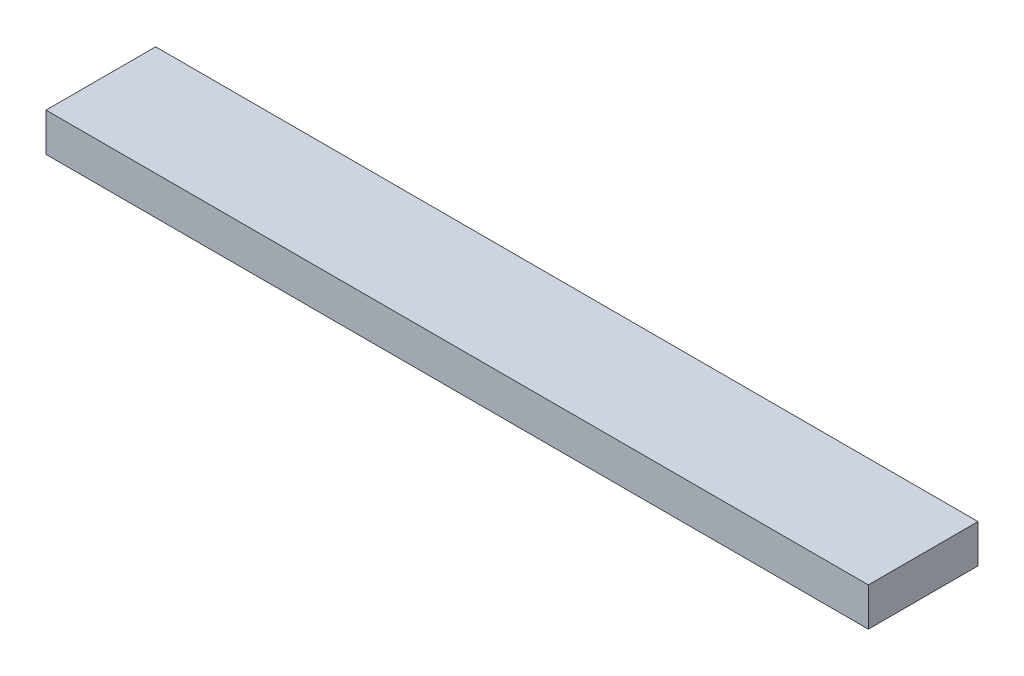
ISO-10303-21;
HEADER;
FILE_DESCRIPTION(('STEP AP214'),'2;1');
FILE_NAME('part.step','',(''),(''),'','','');
FILE_SCHEMA(('AUTOMOTIVE_DESIGN { 1 0 10303 214 1 1 1 1 }'));
ENDSEC;
DATA;
#1=APPLICATION_CONTEXT('core data for automotive mechanical design processes');
#2=APPLICATION_PROTOCOL_DEFINITION('international standard','automotive_design',2000,#1);
#3=PRODUCT_CONTEXT('',#1,'mechanical');
#4=PRODUCT('Part','Part','',(#3));
#5=PRODUCT_RELATED_PRODUCT_CATEGORY('part','',(#4));
#6=PRODUCT_DEFINITION_FORMATION('','',#4);
#7=PRODUCT_DEFINITION_CONTEXT('part definition',#1,'design');
#8=PRODUCT_DEFINITION('design','',#6,#7);
#9=PRODUCT_DEFINITION_SHAPE('','',#8);
#10=(LENGTH_UNIT() NAMED_UNIT(*) SI_UNIT(.MILLI.,.METRE.));
#11=(NAMED_UNIT(*) PLANE_ANGLE_UNIT() SI_UNIT($,.RADIAN.));
#12=(NAMED_UNIT(*) SI_UNIT($,.STERADIAN.) SOLID_ANGLE_UNIT());
#13=UNCERTAINTY_MEASURE_WITH_UNIT(LENGTH_MEASURE(1.E-05),#10,'distance_accuracy_value','');
#14=(GEOMETRIC_REPRESENTATION_CONTEXT(3) GLOBAL_UNCERTAINTY_ASSIGNED_CONTEXT((#13)) GLOBAL_UNIT_ASSIGNED_CONTEXT((#10,
#11,#12)) REPRESENTATION_CONTEXT('',''));
#15=CARTESIAN_POINT('',(0.,0.,0.));
#16=DIRECTION('',(0.,0.,1.));
#17=DIRECTION('',(1.,0.,0.));
#18=AXIS2_PLACEMENT_3D('',#15,#16,#17);
#19=CARTESIAN_POINT('',(0.,7.,0.));
#20=DIRECTION('',(1.,0.,0.));
#21=DIRECTION('',(0.,0.,-1.));
#22=AXIS2_PLACEMENT_3D('',#19,#20,#21);
#23=PLANE('',#22);
#24=DIRECTION('',(0.,0.,1.));
#25=VECTOR('',#24,1.);
#26=CARTESIAN_POINT('',(0.,0.,0.));
#27=LINE('',#26,#25);
#28=CARTESIAN_POINT('',(0.,0.,-20.));
#29=VERTEX_POINT('',#28);
#30=CARTESIAN_POINT('',(0.,0.,0.));
#31=VERTEX_POINT('',#30);
#32=EDGE_CURVE('E103',#29,#31,#27,.T.);
#33=ORIENTED_EDGE('',*,*,#32,.T.);
#34=DIRECTION('',(0.,-1.,0.));
#35=VECTOR('',#34,1.);
#36=CARTESIAN_POINT('',(0.,7.,0.));
#37=LINE('',#36,#35);
#38=CARTESIAN_POINT('',(0.,7.,0.));
#39=VERTEX_POINT('',#38);
#40=EDGE_CURVE('E11',#39,#31,#37,.T.);
#41=ORIENTED_EDGE('',*,*,#40,.F.);
#42=DIRECTION('',(0.,0.,1.));
#43=VECTOR('',#42,1.);
#44=CARTESIAN_POINT('',(0.,7.,0.));
#45=LINE('',#44,#43);
#46=CARTESIAN_POINT('',(0.,7.,-20.));
#47=VERTEX_POINT('',#46);
#48=EDGE_CURVE('E91',#47,#39,#45,.T.);
#49=ORIENTED_EDGE('',*,*,#48,.F.);
#50=DIRECTION('',(0.,-1.,0.));
#51=VECTOR('',#50,1.);
#52=CARTESIAN_POINT('',(0.,7.,-20.));
#53=LINE('',#52,#51);
#54=EDGE_CURVE('E99',#47,#29,#53,.T.);
#55=ORIENTED_EDGE('',*,*,#54,.T.);
#56=EDGE_LOOP('',(#33,#41,#49,#55));
#57=FACE_BOUND('',#56,.T.);
#58=ADVANCED_FACE('F40',(#57),#23,.F.);
#59=CARTESIAN_POINT('',(0.,7.,0.));
#60=DIRECTION('',(0.,0.,-1.));
#61=DIRECTION('',(-1.,0.,0.));
#62=AXIS2_PLACEMENT_3D('',#59,#60,#61);
#63=PLANE('',#62);
#64=DIRECTION('',(1.,0.,0.));
#65=VECTOR('',#64,1.);
#66=CARTESIAN_POINT('',(0.,0.,0.));
#67=LINE('',#66,#65);
#68=CARTESIAN_POINT('',(150.,0.,0.));
#69=VERTEX_POINT('',#68);
#70=EDGE_CURVE('E95',#31,#69,#67,.T.);
#71=ORIENTED_EDGE('',*,*,#70,.T.);
#72=DIRECTION('',(0.,-1.,0.));
#73=VECTOR('',#72,1.);
#74=CARTESIAN_POINT('',(150.,7.,0.));
#75=LINE('',#74,#73);
#76=CARTESIAN_POINT('',(150.,7.,0.));
#77=VERTEX_POINT('',#76);
#78=EDGE_CURVE('E48',#77,#69,#75,.T.);
#79=ORIENTED_EDGE('',*,*,#78,.F.);
#80=DIRECTION('',(1.,0.,0.));
#81=VECTOR('',#80,1.);
#82=CARTESIAN_POINT('',(0.,7.,0.));
#83=LINE('',#82,#81);
#84=EDGE_CURVE('E86',#39,#77,#83,.T.);
#85=ORIENTED_EDGE('',*,*,#84,.F.);
#86=ORIENTED_EDGE('',*,*,#40,.T.);
#87=EDGE_LOOP('',(#71,#79,#85,#86));
#88=FACE_BOUND('',#87,.T.);
#89=ADVANCED_FACE('F94',(#88),#63,.F.);
#90=CARTESIAN_POINT('',(150.,7.,0.));
#91=DIRECTION('',(-1.,0.,0.));
#92=DIRECTION('',(0.,0.,1.));
#93=AXIS2_PLACEMENT_3D('',#90,#91,#92);
#94=PLANE('',#93);
#95=DIRECTION('',(0.,0.,-1.));
#96=VECTOR('',#95,1.);
#97=CARTESIAN_POINT('',(150.,0.,0.));
#98=LINE('',#97,#96);
#99=CARTESIAN_POINT('',(150.,0.,-20.));
#100=VERTEX_POINT('',#99);
#101=EDGE_CURVE('E73',#69,#100,#98,.T.);
#102=ORIENTED_EDGE('',*,*,#101,.T.);
#103=DIRECTION('',(0.,-1.,0.));
#104=VECTOR('',#103,1.);
#105=CARTESIAN_POINT('',(150.,7.,-20.));
#106=LINE('',#105,#104);
#107=CARTESIAN_POINT('',(150.,7.,-20.));
#108=VERTEX_POINT('',#107);
#109=EDGE_CURVE('E96',#108,#100,#106,.T.);
#110=ORIENTED_EDGE('',*,*,#109,.F.);
#111=DIRECTION('',(0.,0.,-1.));
#112=VECTOR('',#111,1.);
#113=CARTESIAN_POINT('',(150.,7.,0.));
#114=LINE('',#113,#112);
#115=EDGE_CURVE('E89',#77,#108,#114,.T.);
#116=ORIENTED_EDGE('',*,*,#115,.F.);
#117=ORIENTED_EDGE('',*,*,#78,.T.);
#118=EDGE_LOOP('',(#102,#110,#116,#117));
#119=FACE_BOUND('',#118,.T.);
#120=ADVANCED_FACE('F97',(#119),#94,.F.);
#121=CARTESIAN_POINT('',(0.,7.,-20.));
#122=DIRECTION('',(0.,0.,1.));
#123=DIRECTION('',(1.,0.,0.));
#124=AXIS2_PLACEMENT_3D('',#121,#122,#123);
#125=PLANE('',#124);
#126=DIRECTION('',(-1.,0.,0.));
#127=VECTOR('',#126,1.);
#128=CARTESIAN_POINT('',(0.,0.,-20.));
#129=LINE('',#128,#127);
#130=EDGE_CURVE('E79',#100,#29,#129,.T.);
#131=ORIENTED_EDGE('',*,*,#130,.T.);
#132=ORIENTED_EDGE('',*,*,#54,.F.);
#133=DIRECTION('',(-1.,0.,0.));
#134=VECTOR('',#133,1.);
#135=CARTESIAN_POINT('',(0.,7.,-20.));
#136=LINE('',#135,#134);
#137=EDGE_CURVE('E56',#108,#47,#136,.T.);
#138=ORIENTED_EDGE('',*,*,#137,.F.);
#139=ORIENTED_EDGE('',*,*,#109,.T.);
#140=EDGE_LOOP('',(#131,#132,#138,#139));
#141=FACE_BOUND('',#140,.T.);
#142=ADVANCED_FACE('F110',(#141),#125,.F.);
#143=CARTESIAN_POINT('',(0.,7.,0.));
#144=DIRECTION('',(0.,-1.,0.));
#145=DIRECTION('',(0.,0.,-1.));
#146=AXIS2_PLACEMENT_3D('',#143,#144,#145);
#147=PLANE('',#146);
#148=ORIENTED_EDGE('',*,*,#48,.T.);
#149=ORIENTED_EDGE('',*,*,#84,.T.);
#150=ORIENTED_EDGE('',*,*,#115,.T.);
#151=ORIENTED_EDGE('',*,*,#137,.T.);
#152=EDGE_LOOP('',(#148,#149,#150,#151));
#153=FACE_BOUND('',#152,.T.);
#154=ADVANCED_FACE('F87',(#153),#147,.F.);
#155=CARTESIAN_POINT('',(0.,0.,0.));
#156=DIRECTION('',(0.,-1.,0.));
#157=DIRECTION('',(0.,0.,-1.));
#158=AXIS2_PLACEMENT_3D('',#155,#156,#157);
#159=PLANE('',#158);
#160=ORIENTED_EDGE('',*,*,#32,.F.);
#161=ORIENTED_EDGE('',*,*,#130,.F.);
#162=ORIENTED_EDGE('',*,*,#101,.F.);
#163=ORIENTED_EDGE('',*,*,#70,.F.);
#164=EDGE_LOOP('',(#160,#161,#162,#163));
#165=FACE_BOUND('',#164,.T.);
#166=ADVANCED_FACE('F113',(#165),#159,.T.);
#167=CLOSED_SHELL('',(#58,#89,#120,#142,#154,#166));
#168=MANIFOLD_SOLID_BREP('B2',#167);
#169=ADVANCED_BREP_SHAPE_REPRESENTATION('',(#18,#168),#14);
#170=SHAPE_DEFINITION_REPRESENTATION(#9,#169);
ENDSEC;
END-ISO-10303-21;
